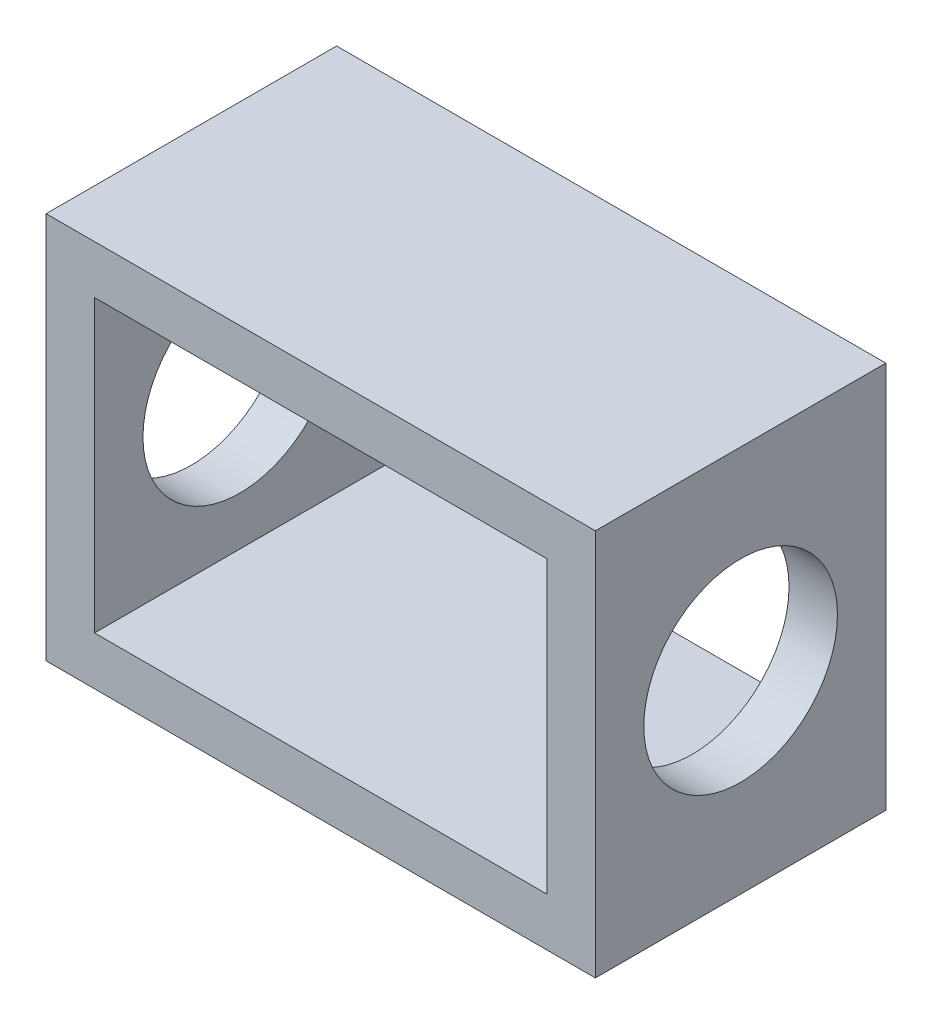
ISO-10303-21;
HEADER;
FILE_DESCRIPTION(('STEP AP214'),'2;1');
FILE_NAME('part.step','',(''),(''),'','','');
FILE_SCHEMA(('AUTOMOTIVE_DESIGN { 1 0 10303 214 1 1 1 1 }'));
ENDSEC;
DATA;
#1=APPLICATION_CONTEXT('core data for automotive mechanical design processes');
#2=APPLICATION_PROTOCOL_DEFINITION('international standard','automotive_design',2000,#1);
#3=PRODUCT_CONTEXT('',#1,'mechanical');
#4=PRODUCT('Part','Part','',(#3));
#5=PRODUCT_RELATED_PRODUCT_CATEGORY('part','',(#4));
#6=PRODUCT_DEFINITION_FORMATION('','',#4);
#7=PRODUCT_DEFINITION_CONTEXT('part definition',#1,'design');
#8=PRODUCT_DEFINITION('design','',#6,#7);
#9=PRODUCT_DEFINITION_SHAPE('','',#8);
#10=(LENGTH_UNIT() NAMED_UNIT(*) SI_UNIT(.MILLI.,.METRE.));
#11=(NAMED_UNIT(*) PLANE_ANGLE_UNIT() SI_UNIT($,.RADIAN.));
#12=(NAMED_UNIT(*) SI_UNIT($,.STERADIAN.) SOLID_ANGLE_UNIT());
#13=UNCERTAINTY_MEASURE_WITH_UNIT(LENGTH_MEASURE(1.E-05),#10,'distance_accuracy_value','');
#14=(GEOMETRIC_REPRESENTATION_CONTEXT(3) GLOBAL_UNCERTAINTY_ASSIGNED_CONTEXT((#13)) GLOBAL_UNIT_ASSIGNED_CONTEXT((#10,
#11,#12)) REPRESENTATION_CONTEXT('',''));
#15=CARTESIAN_POINT('',(0.,0.,0.));
#16=DIRECTION('',(0.,0.,1.));
#17=DIRECTION('',(1.,0.,0.));
#18=AXIS2_PLACEMENT_3D('',#15,#16,#17);
#19=CARTESIAN_POINT('',(0.,0.,30.));
#20=DIRECTION('',(0.,0.,1.));
#21=DIRECTION('',(1.,0.,0.));
#22=AXIS2_PLACEMENT_3D('',#19,#20,#21);
#23=PLANE('',#22);
#24=DIRECTION('',(0.,1.,0.));
#25=VECTOR('',#24,1.);
#26=CARTESIAN_POINT('',(28.3647798742138,17.5,30.));
#27=LINE('',#26,#25);
#28=CARTESIAN_POINT('',(28.3647798742138,-20.,30.));
#29=VERTEX_POINT('',#28);
#30=CARTESIAN_POINT('',(28.3647798742138,20.,30.));
#31=VERTEX_POINT('',#30);
#32=EDGE_CURVE('E182',#29,#31,#27,.T.);
#33=ORIENTED_EDGE('',*,*,#32,.T.);
#34=DIRECTION('',(-1.,0.,0.));
#35=VECTOR('',#34,1.);
#36=CARTESIAN_POINT('',(-25.8647798742138,20.,30.));
#37=LINE('',#36,#35);
#38=CARTESIAN_POINT('',(-28.3647798742138,20.,30.));
#39=VERTEX_POINT('',#38);
#40=EDGE_CURVE('E186',#31,#39,#37,.T.);
#41=ORIENTED_EDGE('',*,*,#40,.T.);
#42=DIRECTION('',(0.,-1.,0.));
#43=VECTOR('',#42,1.);
#44=CARTESIAN_POINT('',(-28.3647798742138,17.5,30.));
#45=LINE('',#44,#43);
#46=CARTESIAN_POINT('',(-28.3647798742138,-20.,30.));
#47=VERTEX_POINT('',#46);
#48=EDGE_CURVE('E190',#39,#47,#45,.T.);
#49=ORIENTED_EDGE('',*,*,#48,.T.);
#50=DIRECTION('',(1.,0.,0.));
#51=VECTOR('',#50,1.);
#52=CARTESIAN_POINT('',(-25.8647798742138,-20.,30.));
#53=LINE('',#52,#51);
#54=EDGE_CURVE('E193',#47,#29,#53,.T.);
#55=ORIENTED_EDGE('',*,*,#54,.T.);
#56=EDGE_LOOP('',(#33,#41,#49,#55));
#57=FACE_BOUND('',#56,.T.);
#58=DIRECTION('',(-1.,0.,0.));
#59=VECTOR('',#58,1.);
#60=CARTESIAN_POINT('',(-25.8647798742138,15.,30.));
#61=LINE('',#60,#59);
#62=CARTESIAN_POINT('',(23.3647798742138,15.,30.));
#63=VERTEX_POINT('',#62);
#64=CARTESIAN_POINT('',(-23.3647798742138,15.,30.));
#65=VERTEX_POINT('',#64);
#66=EDGE_CURVE('E141',#63,#65,#61,.T.);
#67=ORIENTED_EDGE('',*,*,#66,.F.);
#68=DIRECTION('',(0.,1.,0.));
#69=VECTOR('',#68,1.);
#70=CARTESIAN_POINT('',(23.3647798742138,17.5,30.));
#71=LINE('',#70,#69);
#72=CARTESIAN_POINT('',(23.3647798742138,-15.,30.));
#73=VERTEX_POINT('',#72);
#74=EDGE_CURVE('E132',#73,#63,#71,.T.);
#75=ORIENTED_EDGE('',*,*,#74,.F.);
#76=DIRECTION('',(1.,0.,0.));
#77=VECTOR('',#76,1.);
#78=CARTESIAN_POINT('',(-25.8647798742138,-15.,30.));
#79=LINE('',#78,#77);
#80=CARTESIAN_POINT('',(-23.3647798742138,-15.,30.));
#81=VERTEX_POINT('',#80);
#82=EDGE_CURVE('E158',#81,#73,#79,.T.);
#83=ORIENTED_EDGE('',*,*,#82,.F.);
#84=DIRECTION('',(0.,-1.,0.));
#85=VECTOR('',#84,1.);
#86=CARTESIAN_POINT('',(-23.3647798742138,17.5,30.));
#87=LINE('',#86,#85);
#88=EDGE_CURVE('E154',#65,#81,#87,.T.);
#89=ORIENTED_EDGE('',*,*,#88,.F.);
#90=EDGE_LOOP('',(#67,#75,#83,#89));
#91=FACE_BOUND('',#90,.T.);
#92=ADVANCED_FACE('F65',(#57,#91),#23,.T.);
#93=CARTESIAN_POINT('',(0.,0.,0.));
#94=DIRECTION('',(0.,0.,1.));
#95=DIRECTION('',(1.,0.,0.));
#96=AXIS2_PLACEMENT_3D('',#93,#94,#95);
#97=PLANE('',#96);
#98=DIRECTION('',(0.,1.,0.));
#99=VECTOR('',#98,1.);
#100=CARTESIAN_POINT('',(28.3647798742138,17.5,0.));
#101=LINE('',#100,#99);
#102=CARTESIAN_POINT('',(28.3647798742138,-20.,0.));
#103=VERTEX_POINT('',#102);
#104=CARTESIAN_POINT('',(28.3647798742138,20.,0.));
#105=VERTEX_POINT('',#104);
#106=EDGE_CURVE('E150',#103,#105,#101,.T.);
#107=ORIENTED_EDGE('',*,*,#106,.F.);
#108=DIRECTION('',(1.,0.,0.));
#109=VECTOR('',#108,1.);
#110=CARTESIAN_POINT('',(-25.8647798742138,-20.,0.));
#111=LINE('',#110,#109);
#112=CARTESIAN_POINT('',(-28.3647798742138,-20.,0.));
#113=VERTEX_POINT('',#112);
#114=EDGE_CURVE('E187',#113,#103,#111,.T.);
#115=ORIENTED_EDGE('',*,*,#114,.F.);
#116=DIRECTION('',(0.,-1.,0.));
#117=VECTOR('',#116,1.);
#118=CARTESIAN_POINT('',(-28.3647798742138,17.5,0.));
#119=LINE('',#118,#117);
#120=CARTESIAN_POINT('',(-28.3647798742138,20.,0.));
#121=VERTEX_POINT('',#120);
#122=EDGE_CURVE('E203',#121,#113,#119,.T.);
#123=ORIENTED_EDGE('',*,*,#122,.F.);
#124=DIRECTION('',(-1.,0.,0.));
#125=VECTOR('',#124,1.);
#126=CARTESIAN_POINT('',(-25.8647798742138,20.,0.));
#127=LINE('',#126,#125);
#128=EDGE_CURVE('E200',#105,#121,#127,.T.);
#129=ORIENTED_EDGE('',*,*,#128,.F.);
#130=EDGE_LOOP('',(#107,#115,#123,#129));
#131=FACE_BOUND('',#130,.T.);
#132=DIRECTION('',(0.,1.,0.));
#133=VECTOR('',#132,1.);
#134=CARTESIAN_POINT('',(23.3647798742138,17.5,0.));
#135=LINE('',#134,#133);
#136=CARTESIAN_POINT('',(23.3647798742138,-15.,0.));
#137=VERTEX_POINT('',#136);
#138=CARTESIAN_POINT('',(23.3647798742138,15.,0.));
#139=VERTEX_POINT('',#138);
#140=EDGE_CURVE('E90',#137,#139,#135,.T.);
#141=ORIENTED_EDGE('',*,*,#140,.T.);
#142=DIRECTION('',(-1.,0.,0.));
#143=VECTOR('',#142,1.);
#144=CARTESIAN_POINT('',(-25.8647798742138,15.,0.));
#145=LINE('',#144,#143);
#146=CARTESIAN_POINT('',(-23.3647798742138,15.,0.));
#147=VERTEX_POINT('',#146);
#148=EDGE_CURVE('E148',#139,#147,#145,.T.);
#149=ORIENTED_EDGE('',*,*,#148,.T.);
#150=DIRECTION('',(0.,-1.,0.));
#151=VECTOR('',#150,1.);
#152=CARTESIAN_POINT('',(-23.3647798742138,17.5,0.));
#153=LINE('',#152,#151);
#154=CARTESIAN_POINT('',(-23.3647798742138,-15.,0.));
#155=VERTEX_POINT('',#154);
#156=EDGE_CURVE('E169',#147,#155,#153,.T.);
#157=ORIENTED_EDGE('',*,*,#156,.T.);
#158=DIRECTION('',(1.,0.,0.));
#159=VECTOR('',#158,1.);
#160=CARTESIAN_POINT('',(-25.8647798742138,-15.,0.));
#161=LINE('',#160,#159);
#162=EDGE_CURVE('E142',#155,#137,#161,.T.);
#163=ORIENTED_EDGE('',*,*,#162,.T.);
#164=EDGE_LOOP('',(#141,#149,#157,#163));
#165=FACE_BOUND('',#164,.T.);
#166=ADVANCED_FACE('F227',(#131,#165),#97,.F.);
#167=CARTESIAN_POINT('',(28.3647798742138,17.5,30.));
#168=DIRECTION('',(-1.,0.,0.));
#169=DIRECTION('',(0.,0.,1.));
#170=AXIS2_PLACEMENT_3D('',#167,#168,#169);
#171=PLANE('',#170);
#172=CARTESIAN_POINT('',(28.3647798742138,0.,15.));
#173=DIRECTION('',(-1.,0.,0.));
#174=DIRECTION('',(0.,0.,1.));
#175=AXIS2_PLACEMENT_3D('',#172,#173,#174);
#176=CIRCLE('',#175,10.);
#177=CARTESIAN_POINT('',(28.3647798742138,0.,25.));
#178=VERTEX_POINT('',#177);
#179=EDGE_CURVE('E270',#178,#178,#176,.T.);
#180=ORIENTED_EDGE('',*,*,#179,.T.);
#181=EDGE_LOOP('',(#180));
#182=FACE_BOUND('',#181,.T.);
#183=ORIENTED_EDGE('',*,*,#106,.T.);
#184=DIRECTION('',(0.,0.,-1.));
#185=VECTOR('',#184,1.);
#186=CARTESIAN_POINT('',(28.3647798742138,20.,30.));
#187=LINE('',#186,#185);
#188=EDGE_CURVE('E12',#31,#105,#187,.T.);
#189=ORIENTED_EDGE('',*,*,#188,.F.);
#190=ORIENTED_EDGE('',*,*,#32,.F.);
#191=DIRECTION('',(0.,0.,-1.));
#192=VECTOR('',#191,1.);
#193=CARTESIAN_POINT('',(28.3647798742138,-20.,30.));
#194=LINE('',#193,#192);
#195=EDGE_CURVE('E196',#29,#103,#194,.T.);
#196=ORIENTED_EDGE('',*,*,#195,.T.);
#197=EDGE_LOOP('',(#183,#189,#190,#196));
#198=FACE_BOUND('',#197,.T.);
#199=ADVANCED_FACE('F67',(#182,#198),#171,.F.);
#200=CARTESIAN_POINT('',(-25.8647798742138,20.,30.));
#201=DIRECTION('',(0.,-1.,0.));
#202=DIRECTION('',(0.,0.,-1.));
#203=AXIS2_PLACEMENT_3D('',#200,#201,#202);
#204=PLANE('',#203);
#205=ORIENTED_EDGE('',*,*,#128,.T.);
#206=DIRECTION('',(0.,0.,-1.));
#207=VECTOR('',#206,1.);
#208=CARTESIAN_POINT('',(-28.3647798742138,20.,30.));
#209=LINE('',#208,#207);
#210=EDGE_CURVE('E75',#39,#121,#209,.T.);
#211=ORIENTED_EDGE('',*,*,#210,.F.);
#212=ORIENTED_EDGE('',*,*,#40,.F.);
#213=ORIENTED_EDGE('',*,*,#188,.T.);
#214=EDGE_LOOP('',(#205,#211,#212,#213));
#215=FACE_BOUND('',#214,.T.);
#216=ADVANCED_FACE('F237',(#215),#204,.F.);
#217=CARTESIAN_POINT('',(-28.3647798742138,17.5,30.));
#218=DIRECTION('',(1.,0.,0.));
#219=DIRECTION('',(0.,0.,-1.));
#220=AXIS2_PLACEMENT_3D('',#217,#218,#219);
#221=PLANE('',#220);
#222=CARTESIAN_POINT('',(-28.3647798742138,0.,15.));
#223=DIRECTION('',(-1.,0.,0.));
#224=DIRECTION('',(0.,0.,1.));
#225=AXIS2_PLACEMENT_3D('',#222,#223,#224);
#226=CIRCLE('',#225,10.);
#227=CARTESIAN_POINT('',(-28.3647798742138,0.,25.));
#228=VERTEX_POINT('',#227);
#229=EDGE_CURVE('E272',#228,#228,#226,.T.);
#230=ORIENTED_EDGE('',*,*,#229,.F.);
#231=EDGE_LOOP('',(#230));
#232=FACE_BOUND('',#231,.T.);
#233=ORIENTED_EDGE('',*,*,#122,.T.);
#234=DIRECTION('',(0.,0.,-1.));
#235=VECTOR('',#234,1.);
#236=CARTESIAN_POINT('',(-28.3647798742138,-20.,30.));
#237=LINE('',#236,#235);
#238=EDGE_CURVE('E211',#47,#113,#237,.T.);
#239=ORIENTED_EDGE('',*,*,#238,.F.);
#240=ORIENTED_EDGE('',*,*,#48,.F.);
#241=ORIENTED_EDGE('',*,*,#210,.T.);
#242=EDGE_LOOP('',(#233,#239,#240,#241));
#243=FACE_BOUND('',#242,.T.);
#244=ADVANCED_FACE('F221',(#232,#243),#221,.F.);
#245=CARTESIAN_POINT('',(-25.8647798742138,-20.,30.));
#246=DIRECTION('',(0.,1.,0.));
#247=DIRECTION('',(0.,0.,1.));
#248=AXIS2_PLACEMENT_3D('',#245,#246,#247);
#249=PLANE('',#248);
#250=ORIENTED_EDGE('',*,*,#114,.T.);
#251=ORIENTED_EDGE('',*,*,#195,.F.);
#252=ORIENTED_EDGE('',*,*,#54,.F.);
#253=ORIENTED_EDGE('',*,*,#238,.T.);
#254=EDGE_LOOP('',(#250,#251,#252,#253));
#255=FACE_BOUND('',#254,.T.);
#256=ADVANCED_FACE('F231',(#255),#249,.F.);
#257=CARTESIAN_POINT('',(23.3647798742138,17.5,30.));
#258=DIRECTION('',(-1.,0.,0.));
#259=DIRECTION('',(0.,0.,1.));
#260=AXIS2_PLACEMENT_3D('',#257,#258,#259);
#261=PLANE('',#260);
#262=CARTESIAN_POINT('',(23.3647798742138,0.,15.));
#263=DIRECTION('',(-1.,0.,0.));
#264=DIRECTION('',(0.,0.,1.));
#265=AXIS2_PLACEMENT_3D('',#262,#263,#264);
#266=CIRCLE('',#265,10.);
#267=CARTESIAN_POINT('',(23.3647798742138,0.,25.));
#268=VERTEX_POINT('',#267);
#269=EDGE_CURVE('E166',#268,#268,#266,.T.);
#270=ORIENTED_EDGE('',*,*,#269,.F.);
#271=EDGE_LOOP('',(#270));
#272=FACE_BOUND('',#271,.T.);
#273=ORIENTED_EDGE('',*,*,#140,.F.);
#274=DIRECTION('',(0.,0.,-1.));
#275=VECTOR('',#274,1.);
#276=CARTESIAN_POINT('',(23.3647798742138,-15.,30.));
#277=LINE('',#276,#275);
#278=EDGE_CURVE('E136',#73,#137,#277,.T.);
#279=ORIENTED_EDGE('',*,*,#278,.F.);
#280=ORIENTED_EDGE('',*,*,#74,.T.);
#281=DIRECTION('',(0.,0.,-1.));
#282=VECTOR('',#281,1.);
#283=CARTESIAN_POINT('',(23.3647798742138,15.,30.));
#284=LINE('',#283,#282);
#285=EDGE_CURVE('E135',#63,#139,#284,.T.);
#286=ORIENTED_EDGE('',*,*,#285,.T.);
#287=EDGE_LOOP('',(#273,#279,#280,#286));
#288=FACE_BOUND('',#287,.T.);
#289=ADVANCED_FACE('F134',(#272,#288),#261,.T.);
#290=CARTESIAN_POINT('',(-25.8647798742138,15.,30.));
#291=DIRECTION('',(0.,-1.,0.));
#292=DIRECTION('',(0.,0.,-1.));
#293=AXIS2_PLACEMENT_3D('',#290,#291,#292);
#294=PLANE('',#293);
#295=ORIENTED_EDGE('',*,*,#148,.F.);
#296=ORIENTED_EDGE('',*,*,#285,.F.);
#297=ORIENTED_EDGE('',*,*,#66,.T.);
#298=DIRECTION('',(0.,0.,-1.));
#299=VECTOR('',#298,1.);
#300=CARTESIAN_POINT('',(-23.3647798742138,15.,30.));
#301=LINE('',#300,#299);
#302=EDGE_CURVE('E151',#65,#147,#301,.T.);
#303=ORIENTED_EDGE('',*,*,#302,.T.);
#304=EDGE_LOOP('',(#295,#296,#297,#303));
#305=FACE_BOUND('',#304,.T.);
#306=ADVANCED_FACE('F145',(#305),#294,.T.);
#307=CARTESIAN_POINT('',(-23.3647798742138,17.5,30.));
#308=DIRECTION('',(1.,0.,0.));
#309=DIRECTION('',(0.,0.,-1.));
#310=AXIS2_PLACEMENT_3D('',#307,#308,#309);
#311=PLANE('',#310);
#312=CARTESIAN_POINT('',(-23.3647798742138,0.,15.));
#313=DIRECTION('',(1.,0.,0.));
#314=DIRECTION('',(0.,0.,-1.));
#315=AXIS2_PLACEMENT_3D('',#312,#313,#314);
#316=CIRCLE('',#315,10.);
#317=CARTESIAN_POINT('',(-23.3647798742138,0.,4.99999999999999));
#318=VERTEX_POINT('',#317);
#319=EDGE_CURVE('E69',#318,#318,#316,.T.);
#320=ORIENTED_EDGE('',*,*,#319,.F.);
#321=EDGE_LOOP('',(#320));
#322=FACE_BOUND('',#321,.T.);
#323=ORIENTED_EDGE('',*,*,#156,.F.);
#324=ORIENTED_EDGE('',*,*,#302,.F.);
#325=ORIENTED_EDGE('',*,*,#88,.T.);
#326=DIRECTION('',(0.,0.,-1.));
#327=VECTOR('',#326,1.);
#328=CARTESIAN_POINT('',(-23.3647798742138,-15.,30.));
#329=LINE('',#328,#327);
#330=EDGE_CURVE('E82',#81,#155,#329,.T.);
#331=ORIENTED_EDGE('',*,*,#330,.T.);
#332=EDGE_LOOP('',(#323,#324,#325,#331));
#333=FACE_BOUND('',#332,.T.);
#334=ADVANCED_FACE('F263',(#322,#333),#311,.T.);
#335=CARTESIAN_POINT('',(-25.8647798742138,-15.,30.));
#336=DIRECTION('',(0.,1.,0.));
#337=DIRECTION('',(0.,0.,1.));
#338=AXIS2_PLACEMENT_3D('',#335,#336,#337);
#339=PLANE('',#338);
#340=ORIENTED_EDGE('',*,*,#162,.F.);
#341=ORIENTED_EDGE('',*,*,#330,.F.);
#342=ORIENTED_EDGE('',*,*,#82,.T.);
#343=ORIENTED_EDGE('',*,*,#278,.T.);
#344=EDGE_LOOP('',(#340,#341,#342,#343));
#345=FACE_BOUND('',#344,.T.);
#346=ADVANCED_FACE('F287',(#345),#339,.T.);
#347=CARTESIAN_POINT('',(28.3647798742138,0.,15.));
#348=DIRECTION('',(-1.,0.,0.));
#349=DIRECTION('',(0.,0.,1.));
#350=AXIS2_PLACEMENT_3D('',#347,#348,#349);
#351=CYLINDRICAL_SURFACE('',#350,10.);
#352=ORIENTED_EDGE('',*,*,#319,.T.);
#353=EDGE_LOOP('',(#352));
#354=FACE_BOUND('',#353,.T.);
#355=ORIENTED_EDGE('',*,*,#229,.T.);
#356=EDGE_LOOP('',(#355));
#357=FACE_BOUND('',#356,.T.);
#358=ADVANCED_FACE('F282',(#354,#357),#351,.F.);
#359=ORIENTED_EDGE('',*,*,#269,.T.);
#360=EDGE_LOOP('',(#359));
#361=FACE_BOUND('',#360,.T.);
#362=ORIENTED_EDGE('',*,*,#179,.F.);
#363=EDGE_LOOP('',(#362));
#364=FACE_BOUND('',#363,.T.);
#365=ADVANCED_FACE('F280',(#361,#364),#351,.F.);
#366=CLOSED_SHELL('',(#92,#166,#199,#216,#244,#256,#289,#306,#334,#346,#358,#365));
#367=MANIFOLD_SOLID_BREP('B2',#366);
#368=ADVANCED_BREP_SHAPE_REPRESENTATION('',(#18,#367),#14);
#369=SHAPE_DEFINITION_REPRESENTATION(#9,#368);
ENDSEC;
END-ISO-10303-21;
